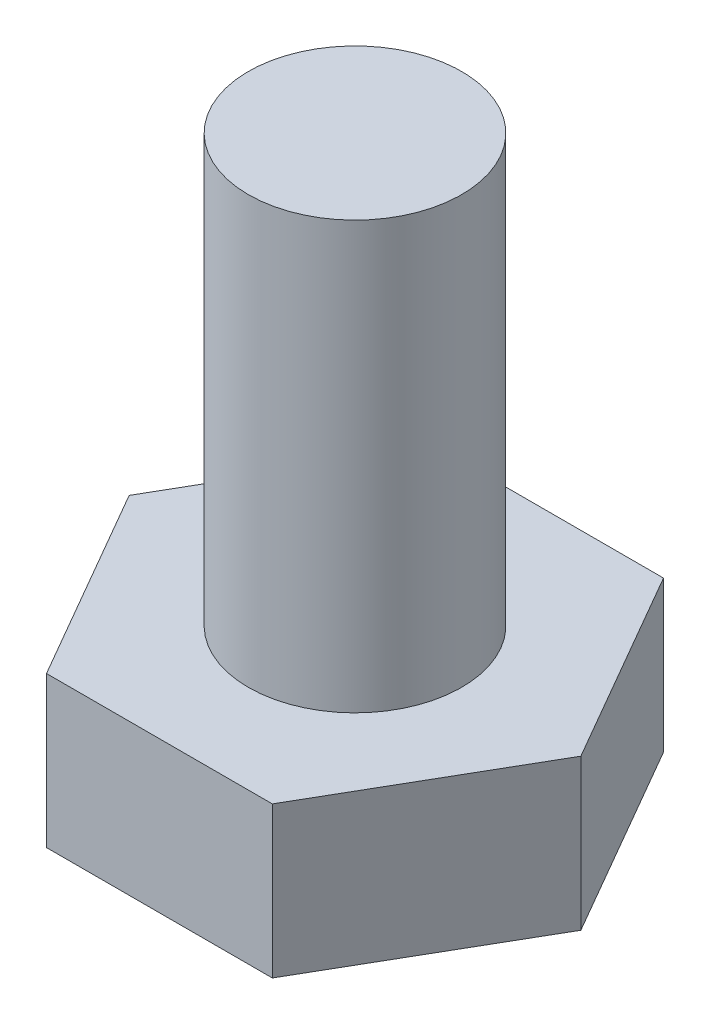
ISO-10303-21;
HEADER;
FILE_DESCRIPTION(('STEP AP214'),'2;1');
FILE_NAME('part.step','',(''),(''),'','','');
FILE_SCHEMA(('AUTOMOTIVE_DESIGN { 1 0 10303 214 1 1 1 1 }'));
ENDSEC;
DATA;
#1=APPLICATION_CONTEXT('core data for automotive mechanical design processes');
#2=APPLICATION_PROTOCOL_DEFINITION('international standard','automotive_design',2000,#1);
#3=PRODUCT_CONTEXT('',#1,'mechanical');
#4=PRODUCT('Part','Part','',(#3));
#5=PRODUCT_RELATED_PRODUCT_CATEGORY('part','',(#4));
#6=PRODUCT_DEFINITION_FORMATION('','',#4);
#7=PRODUCT_DEFINITION_CONTEXT('part definition',#1,'design');
#8=PRODUCT_DEFINITION('design','',#6,#7);
#9=PRODUCT_DEFINITION_SHAPE('','',#8);
#10=(LENGTH_UNIT() NAMED_UNIT(*) SI_UNIT(.MILLI.,.METRE.));
#11=(NAMED_UNIT(*) PLANE_ANGLE_UNIT() SI_UNIT($,.RADIAN.));
#12=(NAMED_UNIT(*) SI_UNIT($,.STERADIAN.) SOLID_ANGLE_UNIT());
#13=UNCERTAINTY_MEASURE_WITH_UNIT(LENGTH_MEASURE(1.E-05),#10,'distance_accuracy_value','');
#14=(GEOMETRIC_REPRESENTATION_CONTEXT(3) GLOBAL_UNCERTAINTY_ASSIGNED_CONTEXT((#13)) GLOBAL_UNIT_ASSIGNED_CONTEXT((#10,
#11,#12)) REPRESENTATION_CONTEXT('',''));
#15=CARTESIAN_POINT('',(0.,0.,0.));
#16=DIRECTION('',(0.,0.,1.));
#17=DIRECTION('',(1.,0.,0.));
#18=AXIS2_PLACEMENT_3D('',#15,#16,#17);
#19=CARTESIAN_POINT('',(0.,6.,0.));
#20=DIRECTION('',(0.,-1.,0.));
#21=DIRECTION('',(0.,0.,-1.));
#22=AXIS2_PLACEMENT_3D('',#19,#20,#21);
#23=CYLINDRICAL_SURFACE('',#22,1.5);
#24=CARTESIAN_POINT('',(0.,6.,0.));
#25=DIRECTION('',(0.,1.,0.));
#26=DIRECTION('',(0.,0.,1.));
#27=AXIS2_PLACEMENT_3D('',#24,#25,#26);
#28=CIRCLE('',#27,1.5);
#29=CARTESIAN_POINT('',(0.,6.,1.5));
#30=VERTEX_POINT('',#29);
#31=EDGE_CURVE('E11',#30,#30,#28,.T.);
#32=ORIENTED_EDGE('',*,*,#31,.F.);
#33=EDGE_LOOP('',(#32));
#34=FACE_BOUND('',#33,.T.);
#35=CARTESIAN_POINT('',(0.,0.,0.));
#36=DIRECTION('',(0.,1.,0.));
#37=DIRECTION('',(0.,0.,1.));
#38=AXIS2_PLACEMENT_3D('',#35,#36,#37);
#39=CIRCLE('',#38,1.5);
#40=CARTESIAN_POINT('',(0.,0.,1.5));
#41=VERTEX_POINT('',#40);
#42=EDGE_CURVE('E37',#41,#41,#39,.T.);
#43=ORIENTED_EDGE('',*,*,#42,.T.);
#44=EDGE_LOOP('',(#43));
#45=FACE_BOUND('',#44,.T.);
#46=ADVANCED_FACE('F34',(#34,#45),#23,.T.);
#47=CARTESIAN_POINT('',(0.,6.,0.));
#48=DIRECTION('',(0.,1.,0.));
#49=DIRECTION('',(0.,0.,1.));
#50=AXIS2_PLACEMENT_3D('',#47,#48,#49);
#51=PLANE('',#50);
#52=ORIENTED_EDGE('',*,*,#31,.T.);
#53=EDGE_LOOP('',(#52));
#54=FACE_BOUND('',#53,.T.);
#55=ADVANCED_FACE('F161',(#54),#51,.T.);
#56=CARTESIAN_POINT('',(-3.17542648054294,-2.12,0.));
#57=DIRECTION('',(0.866025403784439,0.,0.5));
#58=DIRECTION('',(0.5,0.,-0.866025403784439));
#59=AXIS2_PLACEMENT_3D('',#56,#57,#58);
#60=PLANE('',#59);
#61=DIRECTION('',(0.5,0.,-0.866025403784439));
#62=VECTOR('',#61,1.);
#63=CARTESIAN_POINT('',(-3.17542648054294,0.,0.));
#64=LINE('',#63,#62);
#65=CARTESIAN_POINT('',(-3.17542648054294,0.,0.));
#66=VERTEX_POINT('',#65);
#67=CARTESIAN_POINT('',(-1.58771324027147,0.,-2.75));
#68=VERTEX_POINT('',#67);
#69=EDGE_CURVE('E119',#66,#68,#64,.T.);
#70=ORIENTED_EDGE('',*,*,#69,.T.);
#71=DIRECTION('',(0.,1.,0.));
#72=VECTOR('',#71,1.);
#73=CARTESIAN_POINT('',(-1.58771324027147,-2.12,-2.75));
#74=LINE('',#73,#72);
#75=CARTESIAN_POINT('',(-1.58771324027147,-2.12,-2.75));
#76=VERTEX_POINT('',#75);
#77=EDGE_CURVE('E136',#76,#68,#74,.T.);
#78=ORIENTED_EDGE('',*,*,#77,.F.);
#79=DIRECTION('',(0.5,0.,-0.866025403784439));
#80=VECTOR('',#79,1.);
#81=CARTESIAN_POINT('',(-3.17542648054294,-2.12,0.));
#82=LINE('',#81,#80);
#83=CARTESIAN_POINT('',(-3.17542648054294,-2.12,0.));
#84=VERTEX_POINT('',#83);
#85=EDGE_CURVE('E129',#84,#76,#82,.T.);
#86=ORIENTED_EDGE('',*,*,#85,.F.);
#87=DIRECTION('',(0.,1.,0.));
#88=VECTOR('',#87,1.);
#89=CARTESIAN_POINT('',(-3.17542648054294,-2.12,0.));
#90=LINE('',#89,#88);
#91=EDGE_CURVE('E115',#84,#66,#90,.T.);
#92=ORIENTED_EDGE('',*,*,#91,.T.);
#93=EDGE_LOOP('',(#70,#78,#86,#92));
#94=FACE_BOUND('',#93,.T.);
#95=ADVANCED_FACE('F149',(#94),#60,.F.);
#96=CARTESIAN_POINT('',(-1.58771324027147,-2.12,-2.75));
#97=DIRECTION('',(0.,0.,1.));
#98=DIRECTION('',(1.,0.,0.));
#99=AXIS2_PLACEMENT_3D('',#96,#97,#98);
#100=PLANE('',#99);
#101=DIRECTION('',(1.,0.,0.));
#102=VECTOR('',#101,1.);
#103=CARTESIAN_POINT('',(-1.58771324027147,0.,-2.75));
#104=LINE('',#103,#102);
#105=CARTESIAN_POINT('',(1.58771324027147,0.,-2.75));
#106=VERTEX_POINT('',#105);
#107=EDGE_CURVE('E122',#68,#106,#104,.T.);
#108=ORIENTED_EDGE('',*,*,#107,.T.);
#109=DIRECTION('',(0.,1.,0.));
#110=VECTOR('',#109,1.);
#111=CARTESIAN_POINT('',(1.58771324027147,-2.12,-2.75));
#112=LINE('',#111,#110);
#113=CARTESIAN_POINT('',(1.58771324027147,-2.12,-2.75));
#114=VERTEX_POINT('',#113);
#115=EDGE_CURVE('E133',#114,#106,#112,.T.);
#116=ORIENTED_EDGE('',*,*,#115,.F.);
#117=DIRECTION('',(1.,0.,0.));
#118=VECTOR('',#117,1.);
#119=CARTESIAN_POINT('',(-1.58771324027147,-2.12,-2.75));
#120=LINE('',#119,#118);
#121=EDGE_CURVE('E88',#76,#114,#120,.T.);
#122=ORIENTED_EDGE('',*,*,#121,.F.);
#123=ORIENTED_EDGE('',*,*,#77,.T.);
#124=EDGE_LOOP('',(#108,#116,#122,#123));
#125=FACE_BOUND('',#124,.T.);
#126=ADVANCED_FACE('F171',(#125),#100,.F.);
#127=CARTESIAN_POINT('',(1.58771324027147,-2.12,-2.75));
#128=DIRECTION('',(-0.866025403784439,0.,0.5));
#129=DIRECTION('',(0.5,0.,0.866025403784439));
#130=AXIS2_PLACEMENT_3D('',#127,#128,#129);
#131=PLANE('',#130);
#132=DIRECTION('',(0.5,0.,0.866025403784439));
#133=VECTOR('',#132,1.);
#134=CARTESIAN_POINT('',(1.58771324027147,0.,-2.75));
#135=LINE('',#134,#133);
#136=CARTESIAN_POINT('',(3.17542648054294,0.,0.));
#137=VERTEX_POINT('',#136);
#138=EDGE_CURVE('E124',#106,#137,#135,.T.);
#139=ORIENTED_EDGE('',*,*,#138,.T.);
#140=DIRECTION('',(0.,1.,0.));
#141=VECTOR('',#140,1.);
#142=CARTESIAN_POINT('',(3.17542648054294,-2.12,0.));
#143=LINE('',#142,#141);
#144=CARTESIAN_POINT('',(3.17542648054294,-2.12,0.));
#145=VERTEX_POINT('',#144);
#146=EDGE_CURVE('E110',#145,#137,#143,.T.);
#147=ORIENTED_EDGE('',*,*,#146,.F.);
#148=DIRECTION('',(0.5,0.,0.866025403784439));
#149=VECTOR('',#148,1.);
#150=CARTESIAN_POINT('',(1.58771324027147,-2.12,-2.75));
#151=LINE('',#150,#149);
#152=EDGE_CURVE('E101',#114,#145,#151,.T.);
#153=ORIENTED_EDGE('',*,*,#152,.F.);
#154=ORIENTED_EDGE('',*,*,#115,.T.);
#155=EDGE_LOOP('',(#139,#147,#153,#154));
#156=FACE_BOUND('',#155,.T.);
#157=ADVANCED_FACE('F176',(#156),#131,.F.);
#158=CARTESIAN_POINT('',(3.17542648054294,-2.12,0.));
#159=DIRECTION('',(-0.866025403784439,0.,-0.5));
#160=DIRECTION('',(-0.5,0.,0.866025403784439));
#161=AXIS2_PLACEMENT_3D('',#158,#159,#160);
#162=PLANE('',#161);
#163=DIRECTION('',(-0.5,0.,0.866025403784438));
#164=VECTOR('',#163,1.);
#165=CARTESIAN_POINT('',(3.17542648054294,0.,0.));
#166=LINE('',#165,#164);
#167=CARTESIAN_POINT('',(1.58771324027147,0.,2.75));
#168=VERTEX_POINT('',#167);
#169=EDGE_CURVE('E109',#137,#168,#166,.T.);
#170=ORIENTED_EDGE('',*,*,#169,.T.);
#171=DIRECTION('',(0.,1.,0.));
#172=VECTOR('',#171,1.);
#173=CARTESIAN_POINT('',(1.58771324027147,-2.12,2.75));
#174=LINE('',#173,#172);
#175=CARTESIAN_POINT('',(1.58771324027147,-2.12,2.75));
#176=VERTEX_POINT('',#175);
#177=EDGE_CURVE('E106',#176,#168,#174,.T.);
#178=ORIENTED_EDGE('',*,*,#177,.F.);
#179=DIRECTION('',(-0.5,0.,0.866025403784438));
#180=VECTOR('',#179,1.);
#181=CARTESIAN_POINT('',(3.17542648054294,-2.12,0.));
#182=LINE('',#181,#180);
#183=EDGE_CURVE('E95',#145,#176,#182,.T.);
#184=ORIENTED_EDGE('',*,*,#183,.F.);
#185=ORIENTED_EDGE('',*,*,#146,.T.);
#186=EDGE_LOOP('',(#170,#178,#184,#185));
#187=FACE_BOUND('',#186,.T.);
#188=ADVANCED_FACE('F107',(#187),#162,.F.);
#189=CARTESIAN_POINT('',(1.58771324027147,-2.12,2.75));
#190=DIRECTION('',(0.,0.,-1.));
#191=DIRECTION('',(-1.,0.,0.));
#192=AXIS2_PLACEMENT_3D('',#189,#190,#191);
#193=PLANE('',#192);
#194=DIRECTION('',(-1.,0.,0.));
#195=VECTOR('',#194,1.);
#196=CARTESIAN_POINT('',(1.58771324027147,0.,2.75));
#197=LINE('',#196,#195);
#198=CARTESIAN_POINT('',(-1.58771324027147,0.,2.75));
#199=VERTEX_POINT('',#198);
#200=EDGE_CURVE('E73',#168,#199,#197,.T.);
#201=ORIENTED_EDGE('',*,*,#200,.T.);
#202=DIRECTION('',(0.,1.,0.));
#203=VECTOR('',#202,1.);
#204=CARTESIAN_POINT('',(-1.58771324027147,-2.12,2.75));
#205=LINE('',#204,#203);
#206=CARTESIAN_POINT('',(-1.58771324027147,-2.12,2.75));
#207=VERTEX_POINT('',#206);
#208=EDGE_CURVE('E111',#207,#199,#205,.T.);
#209=ORIENTED_EDGE('',*,*,#208,.F.);
#210=DIRECTION('',(-1.,0.,0.));
#211=VECTOR('',#210,1.);
#212=CARTESIAN_POINT('',(1.58771324027147,-2.12,2.75));
#213=LINE('',#212,#211);
#214=EDGE_CURVE('E99',#176,#207,#213,.T.);
#215=ORIENTED_EDGE('',*,*,#214,.F.);
#216=ORIENTED_EDGE('',*,*,#177,.T.);
#217=EDGE_LOOP('',(#201,#209,#215,#216));
#218=FACE_BOUND('',#217,.T.);
#219=ADVANCED_FACE('F113',(#218),#193,.F.);
#220=CARTESIAN_POINT('',(-1.58771324027147,-2.12,2.75));
#221=DIRECTION('',(0.866025403784438,0.,-0.5));
#222=DIRECTION('',(-0.5,0.,-0.866025403784439));
#223=AXIS2_PLACEMENT_3D('',#220,#221,#222);
#224=PLANE('',#223);
#225=DIRECTION('',(-0.5,0.,-0.866025403784438));
#226=VECTOR('',#225,1.);
#227=CARTESIAN_POINT('',(-1.58771324027147,0.,2.75));
#228=LINE('',#227,#226);
#229=EDGE_CURVE('E79',#199,#66,#228,.T.);
#230=ORIENTED_EDGE('',*,*,#229,.T.);
#231=ORIENTED_EDGE('',*,*,#91,.F.);
#232=DIRECTION('',(-0.5,0.,-0.866025403784438));
#233=VECTOR('',#232,1.);
#234=CARTESIAN_POINT('',(-1.58771324027147,-2.12,2.75));
#235=LINE('',#234,#233);
#236=EDGE_CURVE('E50',#207,#84,#235,.T.);
#237=ORIENTED_EDGE('',*,*,#236,.F.);
#238=ORIENTED_EDGE('',*,*,#208,.T.);
#239=EDGE_LOOP('',(#230,#231,#237,#238));
#240=FACE_BOUND('',#239,.T.);
#241=ADVANCED_FACE('F151',(#240),#224,.F.);
#242=CARTESIAN_POINT('',(0.,-2.12,0.));
#243=DIRECTION('',(0.,-1.,0.));
#244=DIRECTION('',(0.,0.,-1.));
#245=AXIS2_PLACEMENT_3D('',#242,#243,#244);
#246=PLANE('',#245);
#247=ORIENTED_EDGE('',*,*,#85,.T.);
#248=ORIENTED_EDGE('',*,*,#121,.T.);
#249=ORIENTED_EDGE('',*,*,#152,.T.);
#250=ORIENTED_EDGE('',*,*,#183,.T.);
#251=ORIENTED_EDGE('',*,*,#214,.T.);
#252=ORIENTED_EDGE('',*,*,#236,.T.);
#253=EDGE_LOOP('',(#247,#248,#249,#250,#251,#252));
#254=FACE_BOUND('',#253,.T.);
#255=ADVANCED_FACE('F97',(#254),#246,.T.);
#256=CARTESIAN_POINT('',(0.,0.,0.));
#257=DIRECTION('',(0.,-1.,0.));
#258=DIRECTION('',(0.,0.,-1.));
#259=AXIS2_PLACEMENT_3D('',#256,#257,#258);
#260=PLANE('',#259);
#261=ORIENTED_EDGE('',*,*,#42,.F.);
#262=EDGE_LOOP('',(#261));
#263=FACE_BOUND('',#262,.T.);
#264=ORIENTED_EDGE('',*,*,#69,.F.);
#265=ORIENTED_EDGE('',*,*,#229,.F.);
#266=ORIENTED_EDGE('',*,*,#200,.F.);
#267=ORIENTED_EDGE('',*,*,#169,.F.);
#268=ORIENTED_EDGE('',*,*,#138,.F.);
#269=ORIENTED_EDGE('',*,*,#107,.F.);
#270=EDGE_LOOP('',(#264,#265,#266,#267,#268,#269));
#271=FACE_BOUND('',#270,.T.);
#272=ADVANCED_FACE('F142',(#263,#271),#260,.F.);
#273=CLOSED_SHELL('',(#46,#55,#95,#126,#157,#188,#219,#241,#255,#272));
#274=MANIFOLD_SOLID_BREP('B2',#273);
#275=ADVANCED_BREP_SHAPE_REPRESENTATION('',(#18,#274),#14);
#276=SHAPE_DEFINITION_REPRESENTATION(#9,#275);
ENDSEC;
END-ISO-10303-21;
